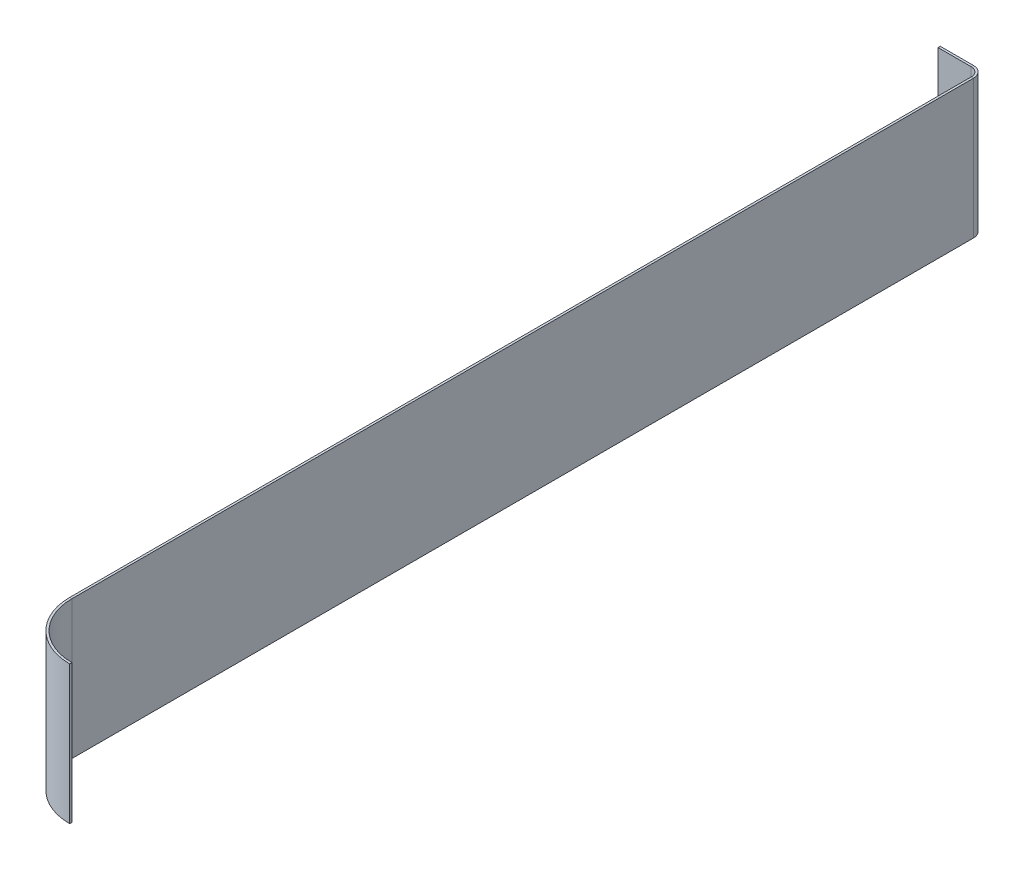
ISO-10303-21;
HEADER;
FILE_DESCRIPTION(('STEP AP214'),'2;1');
FILE_NAME('part.step','',(''),(''),'','','');
FILE_SCHEMA(('AUTOMOTIVE_DESIGN { 1 0 10303 214 1 1 1 1 }'));
ENDSEC;
DATA;
#1=APPLICATION_CONTEXT('core data for automotive mechanical design processes');
#2=APPLICATION_PROTOCOL_DEFINITION('international standard','automotive_design',2000,#1);
#3=PRODUCT_CONTEXT('',#1,'mechanical');
#4=PRODUCT('Part','Part','',(#3));
#5=PRODUCT_RELATED_PRODUCT_CATEGORY('part','',(#4));
#6=PRODUCT_DEFINITION_FORMATION('','',#4);
#7=PRODUCT_DEFINITION_CONTEXT('part definition',#1,'design');
#8=PRODUCT_DEFINITION('design','',#6,#7);
#9=PRODUCT_DEFINITION_SHAPE('','',#8);
#10=(LENGTH_UNIT() NAMED_UNIT(*) SI_UNIT(.MILLI.,.METRE.));
#11=(NAMED_UNIT(*) PLANE_ANGLE_UNIT() SI_UNIT($,.RADIAN.));
#12=(NAMED_UNIT(*) SI_UNIT($,.STERADIAN.) SOLID_ANGLE_UNIT());
#13=UNCERTAINTY_MEASURE_WITH_UNIT(LENGTH_MEASURE(1.E-05),#10,'distance_accuracy_value','');
#14=(GEOMETRIC_REPRESENTATION_CONTEXT(3) GLOBAL_UNCERTAINTY_ASSIGNED_CONTEXT((#13)) GLOBAL_UNIT_ASSIGNED_CONTEXT((#10,
#11,#12)) REPRESENTATION_CONTEXT('',''));
#15=CARTESIAN_POINT('',(0.,0.,0.));
#16=DIRECTION('',(0.,0.,1.));
#17=DIRECTION('',(1.,0.,0.));
#18=AXIS2_PLACEMENT_3D('',#15,#16,#17);
#19=CARTESIAN_POINT('',(-1770.,-495.,5.99999999999999));
#20=DIRECTION('',(0.,1.,0.));
#21=DIRECTION('',(0.,0.,1.));
#22=AXIS2_PLACEMENT_3D('',#19,#20,#21);
#23=PLANE('',#22);
#24=DIRECTION('',(0.,0.,1.));
#25=VECTOR('',#24,1.);
#26=CARTESIAN_POINT('',(-1750.,-495.,22.));
#27=LINE('',#26,#25);
#28=CARTESIAN_POINT('',(-1750.,-495.,22.));
#29=VERTEX_POINT('',#28);
#30=CARTESIAN_POINT('',(-1750.,-495.,1650.));
#31=VERTEX_POINT('',#30);
#32=EDGE_CURVE('E184',#29,#31,#27,.T.);
#33=ORIENTED_EDGE('',*,*,#32,.F.);
#34=DIRECTION('',(-1.,0.,0.));
#35=VECTOR('',#34,1.);
#36=CARTESIAN_POINT('',(-1750.,-495.,22.));
#37=LINE('',#36,#35);
#38=CARTESIAN_POINT('',(-1754.,-495.,22.));
#39=VERTEX_POINT('',#38);
#40=EDGE_CURVE('E11',#29,#39,#37,.T.);
#41=ORIENTED_EDGE('',*,*,#40,.T.);
#42=DIRECTION('',(0.,0.,1.));
#43=VECTOR('',#42,1.);
#44=CARTESIAN_POINT('',(-1754.,-495.,22.));
#45=LINE('',#44,#43);
#46=CARTESIAN_POINT('',(-1754.,-495.,1650.));
#47=VERTEX_POINT('',#46);
#48=EDGE_CURVE('E190',#39,#47,#45,.T.);
#49=ORIENTED_EDGE('',*,*,#48,.T.);
#50=DIRECTION('',(1.,0.,0.));
#51=VECTOR('',#50,1.);
#52=CARTESIAN_POINT('',(-1754.,-495.,1650.));
#53=LINE('',#52,#51);
#54=EDGE_CURVE('E199',#47,#31,#53,.T.);
#55=ORIENTED_EDGE('',*,*,#54,.T.);
#56=EDGE_LOOP('',(#33,#41,#49,#55));
#57=FACE_BOUND('',#56,.T.);
#58=ADVANCED_FACE('F36',(#57),#23,.T.);
#59=CARTESIAN_POINT('',(-1754.,-745.,22.));
#60=DIRECTION('',(-1.,0.,0.));
#61=DIRECTION('',(0.,0.,1.));
#62=AXIS2_PLACEMENT_3D('',#59,#60,#61);
#63=PLANE('',#62);
#64=ORIENTED_EDGE('',*,*,#48,.F.);
#65=DIRECTION('',(0.,1.,0.));
#66=VECTOR('',#65,1.);
#67=CARTESIAN_POINT('',(-1754.,-745.,22.));
#68=LINE('',#67,#66);
#69=CARTESIAN_POINT('',(-1754.,-745.,22.));
#70=VERTEX_POINT('',#69);
#71=EDGE_CURVE('E43',#70,#39,#68,.T.);
#72=ORIENTED_EDGE('',*,*,#71,.F.);
#73=DIRECTION('',(0.,0.,1.));
#74=VECTOR('',#73,1.);
#75=CARTESIAN_POINT('',(-1754.,-745.,22.));
#76=LINE('',#75,#74);
#77=CARTESIAN_POINT('',(-1754.,-745.,1650.));
#78=VERTEX_POINT('',#77);
#79=EDGE_CURVE('E189',#70,#78,#76,.T.);
#80=ORIENTED_EDGE('',*,*,#79,.T.);
#81=DIRECTION('',(0.,1.,0.));
#82=VECTOR('',#81,1.);
#83=CARTESIAN_POINT('',(-1754.,-745.,1650.));
#84=LINE('',#83,#82);
#85=EDGE_CURVE('E202',#78,#47,#84,.T.);
#86=ORIENTED_EDGE('',*,*,#85,.T.);
#87=EDGE_LOOP('',(#64,#72,#80,#86));
#88=FACE_BOUND('',#87,.T.);
#89=ADVANCED_FACE('F260',(#88),#63,.T.);
#90=CARTESIAN_POINT('',(-1750.,-745.,22.));
#91=DIRECTION('',(-1.,0.,0.));
#92=DIRECTION('',(0.,0.,1.));
#93=AXIS2_PLACEMENT_3D('',#90,#91,#92);
#94=PLANE('',#93);
#95=ORIENTED_EDGE('',*,*,#32,.T.);
#96=DIRECTION('',(0.,1.,0.));
#97=VECTOR('',#96,1.);
#98=CARTESIAN_POINT('',(-1750.,-745.,1650.));
#99=LINE('',#98,#97);
#100=CARTESIAN_POINT('',(-1750.,-745.,1650.));
#101=VERTEX_POINT('',#100);
#102=EDGE_CURVE('E193',#101,#31,#99,.T.);
#103=ORIENTED_EDGE('',*,*,#102,.F.);
#104=DIRECTION('',(0.,0.,1.));
#105=VECTOR('',#104,1.);
#106=CARTESIAN_POINT('',(-1750.,-745.,22.));
#107=LINE('',#106,#105);
#108=CARTESIAN_POINT('',(-1750.,-745.,22.));
#109=VERTEX_POINT('',#108);
#110=EDGE_CURVE('E186',#109,#101,#107,.T.);
#111=ORIENTED_EDGE('',*,*,#110,.F.);
#112=DIRECTION('',(0.,1.,0.));
#113=VECTOR('',#112,1.);
#114=CARTESIAN_POINT('',(-1750.,-745.,22.));
#115=LINE('',#114,#113);
#116=EDGE_CURVE('E208',#109,#29,#115,.T.);
#117=ORIENTED_EDGE('',*,*,#116,.T.);
#118=EDGE_LOOP('',(#95,#103,#111,#117));
#119=FACE_BOUND('',#118,.T.);
#120=ADVANCED_FACE('F237',(#119),#94,.F.);
#121=CARTESIAN_POINT('',(-1650.,-745.,1650.));
#122=DIRECTION('',(0.,1.,0.));
#123=DIRECTION('',(1.,0.,0.));
#124=AXIS2_PLACEMENT_3D('',#121,#122,#123);
#125=PLANE('',#124);
#126=ORIENTED_EDGE('',*,*,#110,.T.);
#127=DIRECTION('',(-1.,0.,0.));
#128=VECTOR('',#127,1.);
#129=CARTESIAN_POINT('',(-1750.,-745.,1650.));
#130=LINE('',#129,#128);
#131=EDGE_CURVE('E205',#101,#78,#130,.T.);
#132=ORIENTED_EDGE('',*,*,#131,.T.);
#133=ORIENTED_EDGE('',*,*,#79,.F.);
#134=DIRECTION('',(1.,0.,0.));
#135=VECTOR('',#134,1.);
#136=CARTESIAN_POINT('',(-1754.,-745.,22.));
#137=LINE('',#136,#135);
#138=EDGE_CURVE('E211',#70,#109,#137,.T.);
#139=ORIENTED_EDGE('',*,*,#138,.T.);
#140=EDGE_LOOP('',(#126,#132,#133,#139));
#141=FACE_BOUND('',#140,.T.);
#142=ADVANCED_FACE('F215',(#141),#125,.F.);
#143=CARTESIAN_POINT('',(-1650.,-745.,1650.));
#144=DIRECTION('',(0.,1.,0.));
#145=DIRECTION('',(0.,0.,1.));
#146=AXIS2_PLACEMENT_3D('',#143,#144,#145);
#147=PLANE('',#146);
#148=DIRECTION('',(0.,0.,-1.));
#149=VECTOR('',#148,1.);
#150=CARTESIAN_POINT('',(-1650.,-745.,1750.));
#151=LINE('',#150,#149);
#152=CARTESIAN_POINT('',(-1650.,-745.,1754.));
#153=VERTEX_POINT('',#152);
#154=CARTESIAN_POINT('',(-1650.,-745.,1750.));
#155=VERTEX_POINT('',#154);
#156=EDGE_CURVE('E182',#153,#155,#151,.T.);
#157=ORIENTED_EDGE('',*,*,#156,.F.);
#158=CARTESIAN_POINT('',(-1650.,-745.,1650.));
#159=DIRECTION('',(0.,-1.,0.));
#160=DIRECTION('',(0.,0.,-1.));
#161=AXIS2_PLACEMENT_3D('',#158,#159,#160);
#162=CIRCLE('',#161,104.);
#163=EDGE_CURVE('E57',#153,#78,#162,.T.);
#164=ORIENTED_EDGE('',*,*,#163,.T.);
#165=ORIENTED_EDGE('',*,*,#131,.F.);
#166=CARTESIAN_POINT('',(-1650.,-745.,1650.));
#167=DIRECTION('',(0.,-1.,0.));
#168=DIRECTION('',(0.,0.,-1.));
#169=AXIS2_PLACEMENT_3D('',#166,#167,#168);
#170=CIRCLE('',#169,100.);
#171=EDGE_CURVE('E165',#155,#101,#170,.T.);
#172=ORIENTED_EDGE('',*,*,#171,.F.);
#173=EDGE_LOOP('',(#157,#164,#165,#172));
#174=FACE_BOUND('',#173,.T.);
#175=ADVANCED_FACE('F249',(#174),#147,.F.);
#176=CARTESIAN_POINT('',(-1650.,-495.,1650.));
#177=DIRECTION('',(0.,-1.,0.));
#178=DIRECTION('',(0.,0.,-1.));
#179=AXIS2_PLACEMENT_3D('',#176,#177,#178);
#180=PLANE('',#179);
#181=ORIENTED_EDGE('',*,*,#54,.F.);
#182=CARTESIAN_POINT('',(-1650.,-495.,1650.));
#183=DIRECTION('',(0.,-1.,0.));
#184=DIRECTION('',(0.,0.,-1.));
#185=AXIS2_PLACEMENT_3D('',#182,#183,#184);
#186=CIRCLE('',#185,104.);
#187=CARTESIAN_POINT('',(-1650.,-495.,1754.));
#188=VERTEX_POINT('',#187);
#189=EDGE_CURVE('E176',#47,#188,#186,.F.);
#190=ORIENTED_EDGE('',*,*,#189,.T.);
#191=DIRECTION('',(0.,0.,-1.));
#192=VECTOR('',#191,1.);
#193=CARTESIAN_POINT('',(-1650.,-495.,1750.));
#194=LINE('',#193,#192);
#195=CARTESIAN_POINT('',(-1650.,-495.,1750.));
#196=VERTEX_POINT('',#195);
#197=EDGE_CURVE('E175',#188,#196,#194,.T.);
#198=ORIENTED_EDGE('',*,*,#197,.T.);
#199=CARTESIAN_POINT('',(-1650.,-495.,1650.));
#200=DIRECTION('',(0.,1.,0.));
#201=DIRECTION('',(0.,0.,1.));
#202=AXIS2_PLACEMENT_3D('',#199,#200,#201);
#203=CIRCLE('',#202,100.);
#204=EDGE_CURVE('E168',#31,#196,#203,.T.);
#205=ORIENTED_EDGE('',*,*,#204,.F.);
#206=EDGE_LOOP('',(#181,#190,#198,#205));
#207=FACE_BOUND('',#206,.T.);
#208=ADVANCED_FACE('F244',(#207),#180,.F.);
#209=CARTESIAN_POINT('',(-1650.,-620.,1750.));
#210=DIRECTION('',(-1.,0.,0.));
#211=DIRECTION('',(0.,-1.,0.));
#212=AXIS2_PLACEMENT_3D('',#209,#210,#211);
#213=PLANE('',#212);
#214=DIRECTION('',(0.,-1.,0.));
#215=VECTOR('',#214,1.);
#216=CARTESIAN_POINT('',(-1650.,-323.803389053165,1754.));
#217=LINE('',#216,#215);
#218=EDGE_CURVE('E169',#188,#153,#217,.T.);
#219=ORIENTED_EDGE('',*,*,#218,.T.);
#220=ORIENTED_EDGE('',*,*,#156,.T.);
#221=DIRECTION('',(0.,-1.,0.));
#222=VECTOR('',#221,1.);
#223=CARTESIAN_POINT('',(-1650.,-495.,1750.));
#224=LINE('',#223,#222);
#225=EDGE_CURVE('E172',#196,#155,#224,.T.);
#226=ORIENTED_EDGE('',*,*,#225,.F.);
#227=ORIENTED_EDGE('',*,*,#197,.F.);
#228=EDGE_LOOP('',(#219,#220,#226,#227));
#229=FACE_BOUND('',#228,.T.);
#230=ADVANCED_FACE('F248',(#229),#213,.F.);
#231=CARTESIAN_POINT('',(-1650.,-323.803389053165,1650.));
#232=DIRECTION('',(0.,-1.,0.));
#233=DIRECTION('',(0.,0.,-1.));
#234=AXIS2_PLACEMENT_3D('',#231,#232,#233);
#235=CYLINDRICAL_SURFACE('',#234,100.);
#236=ORIENTED_EDGE('',*,*,#204,.T.);
#237=ORIENTED_EDGE('',*,*,#225,.T.);
#238=ORIENTED_EDGE('',*,*,#171,.T.);
#239=ORIENTED_EDGE('',*,*,#102,.T.);
#240=EDGE_LOOP('',(#236,#237,#238,#239));
#241=FACE_BOUND('',#240,.T.);
#242=ADVANCED_FACE('F240',(#241),#235,.F.);
#243=CARTESIAN_POINT('',(-1650.,-323.803389053165,1650.));
#244=DIRECTION('',(0.,-1.,0.));
#245=DIRECTION('',(0.,0.,-1.));
#246=AXIS2_PLACEMENT_3D('',#243,#244,#245);
#247=CYLINDRICAL_SURFACE('',#246,104.);
#248=ORIENTED_EDGE('',*,*,#189,.F.);
#249=ORIENTED_EDGE('',*,*,#85,.F.);
#250=ORIENTED_EDGE('',*,*,#163,.F.);
#251=ORIENTED_EDGE('',*,*,#218,.F.);
#252=EDGE_LOOP('',(#248,#249,#250,#251));
#253=FACE_BOUND('',#252,.T.);
#254=ADVANCED_FACE('F268',(#253),#247,.T.);
#255=CARTESIAN_POINT('',(-1770.,-745.,22.));
#256=DIRECTION('',(0.,-1.,0.));
#257=DIRECTION('',(0.,0.,-1.));
#258=AXIS2_PLACEMENT_3D('',#255,#256,#257);
#259=PLANE('',#258);
#260=ORIENTED_EDGE('',*,*,#138,.F.);
#261=CARTESIAN_POINT('',(-1770.,-745.,22.));
#262=DIRECTION('',(0.,1.,0.));
#263=DIRECTION('',(0.,0.,1.));
#264=AXIS2_PLACEMENT_3D('',#261,#262,#263);
#265=CIRCLE('',#264,16.);
#266=CARTESIAN_POINT('',(-1770.,-745.,6.00000000000001));
#267=VERTEX_POINT('',#266);
#268=EDGE_CURVE('E161',#70,#267,#265,.T.);
#269=ORIENTED_EDGE('',*,*,#268,.T.);
#270=DIRECTION('',(0.,0.,1.));
#271=VECTOR('',#270,1.);
#272=CARTESIAN_POINT('',(-1770.,-745.,2.));
#273=LINE('',#272,#271);
#274=CARTESIAN_POINT('',(-1770.,-745.,2.));
#275=VERTEX_POINT('',#274);
#276=EDGE_CURVE('E133',#275,#267,#273,.T.);
#277=ORIENTED_EDGE('',*,*,#276,.F.);
#278=CARTESIAN_POINT('',(-1770.,-745.,22.));
#279=DIRECTION('',(0.,1.,0.));
#280=DIRECTION('',(0.,0.,1.));
#281=AXIS2_PLACEMENT_3D('',#278,#279,#280);
#282=CIRCLE('',#281,20.);
#283=EDGE_CURVE('E153',#109,#275,#282,.T.);
#284=ORIENTED_EDGE('',*,*,#283,.F.);
#285=EDGE_LOOP('',(#260,#269,#277,#284));
#286=FACE_BOUND('',#285,.T.);
#287=ADVANCED_FACE('F219',(#286),#259,.T.);
#288=CARTESIAN_POINT('',(-1770.,-495.,22.));
#289=DIRECTION('',(0.,1.,0.));
#290=DIRECTION('',(0.,0.,1.));
#291=AXIS2_PLACEMENT_3D('',#288,#289,#290);
#292=PLANE('',#291);
#293=DIRECTION('',(0.,0.,-1.));
#294=VECTOR('',#293,1.);
#295=CARTESIAN_POINT('',(-1770.,-495.,6.00000000000001));
#296=LINE('',#295,#294);
#297=CARTESIAN_POINT('',(-1770.,-495.,6.00000000000001));
#298=VERTEX_POINT('',#297);
#299=CARTESIAN_POINT('',(-1770.,-495.,1.99999999999999));
#300=VERTEX_POINT('',#299);
#301=EDGE_CURVE('E164',#298,#300,#296,.T.);
#302=ORIENTED_EDGE('',*,*,#301,.F.);
#303=CARTESIAN_POINT('',(-1770.,-495.,22.));
#304=DIRECTION('',(0.,1.,0.));
#305=DIRECTION('',(0.,0.,1.));
#306=AXIS2_PLACEMENT_3D('',#303,#304,#305);
#307=CIRCLE('',#306,16.);
#308=EDGE_CURVE('E157',#298,#39,#307,.F.);
#309=ORIENTED_EDGE('',*,*,#308,.T.);
#310=ORIENTED_EDGE('',*,*,#40,.F.);
#311=CARTESIAN_POINT('',(-1770.,-495.,22.));
#312=DIRECTION('',(0.,-1.,0.));
#313=DIRECTION('',(0.,0.,-1.));
#314=AXIS2_PLACEMENT_3D('',#311,#312,#313);
#315=CIRCLE('',#314,20.);
#316=EDGE_CURVE('E156',#300,#29,#315,.T.);
#317=ORIENTED_EDGE('',*,*,#316,.F.);
#318=EDGE_LOOP('',(#302,#309,#310,#317));
#319=FACE_BOUND('',#318,.T.);
#320=ADVANCED_FACE('F225',(#319),#292,.T.);
#321=CARTESIAN_POINT('',(-1770.,-871.469519129105,22.));
#322=DIRECTION('',(0.,1.,0.));
#323=DIRECTION('',(0.,0.,1.));
#324=AXIS2_PLACEMENT_3D('',#321,#322,#323);
#325=CYLINDRICAL_SURFACE('',#324,20.);
#326=ORIENTED_EDGE('',*,*,#316,.T.);
#327=ORIENTED_EDGE('',*,*,#116,.F.);
#328=ORIENTED_EDGE('',*,*,#283,.T.);
#329=DIRECTION('',(0.,1.,0.));
#330=VECTOR('',#329,1.);
#331=CARTESIAN_POINT('',(-1770.,-745.,2.));
#332=LINE('',#331,#330);
#333=EDGE_CURVE('E150',#275,#300,#332,.T.);
#334=ORIENTED_EDGE('',*,*,#333,.T.);
#335=EDGE_LOOP('',(#326,#327,#328,#334));
#336=FACE_BOUND('',#335,.T.);
#337=ADVANCED_FACE('F234',(#336),#325,.T.);
#338=CARTESIAN_POINT('',(-1770.,-871.469519129105,22.));
#339=DIRECTION('',(0.,1.,0.));
#340=DIRECTION('',(0.,0.,1.));
#341=AXIS2_PLACEMENT_3D('',#338,#339,#340);
#342=CYLINDRICAL_SURFACE('',#341,16.);
#343=ORIENTED_EDGE('',*,*,#308,.F.);
#344=DIRECTION('',(0.,1.,0.));
#345=VECTOR('',#344,1.);
#346=CARTESIAN_POINT('',(-1770.,-745.,6.00000000000001));
#347=LINE('',#346,#345);
#348=EDGE_CURVE('E138',#267,#298,#347,.T.);
#349=ORIENTED_EDGE('',*,*,#348,.F.);
#350=ORIENTED_EDGE('',*,*,#268,.F.);
#351=ORIENTED_EDGE('',*,*,#71,.T.);
#352=EDGE_LOOP('',(#343,#349,#350,#351));
#353=FACE_BOUND('',#352,.T.);
#354=ADVANCED_FACE('F221',(#353),#342,.F.);
#355=CARTESIAN_POINT('',(-1830.,-745.,6.00000000000001));
#356=DIRECTION('',(1.,0.,0.));
#357=DIRECTION('',(0.,0.,-1.));
#358=AXIS2_PLACEMENT_3D('',#355,#356,#357);
#359=PLANE('',#358);
#360=DIRECTION('',(0.,0.,-1.));
#361=VECTOR('',#360,1.);
#362=CARTESIAN_POINT('',(-1830.,-495.,6.00000000000001));
#363=LINE('',#362,#361);
#364=CARTESIAN_POINT('',(-1830.,-495.,6.00000000000001));
#365=VERTEX_POINT('',#364);
#366=CARTESIAN_POINT('',(-1830.,-495.,2.));
#367=VERTEX_POINT('',#366);
#368=EDGE_CURVE('E123',#365,#367,#363,.T.);
#369=ORIENTED_EDGE('',*,*,#368,.T.);
#370=DIRECTION('',(0.,1.,0.));
#371=VECTOR('',#370,1.);
#372=CARTESIAN_POINT('',(-1830.,-745.,2.));
#373=LINE('',#372,#371);
#374=CARTESIAN_POINT('',(-1830.,-745.,2.));
#375=VERTEX_POINT('',#374);
#376=EDGE_CURVE('E129',#375,#367,#373,.T.);
#377=ORIENTED_EDGE('',*,*,#376,.F.);
#378=DIRECTION('',(0.,0.,-1.));
#379=VECTOR('',#378,1.);
#380=CARTESIAN_POINT('',(-1830.,-745.,6.00000000000001));
#381=LINE('',#380,#379);
#382=CARTESIAN_POINT('',(-1830.,-745.,6.00000000000001));
#383=VERTEX_POINT('',#382);
#384=EDGE_CURVE('E126',#383,#375,#381,.T.);
#385=ORIENTED_EDGE('',*,*,#384,.F.);
#386=DIRECTION('',(0.,1.,0.));
#387=VECTOR('',#386,1.);
#388=CARTESIAN_POINT('',(-1830.,-745.,6.00000000000001));
#389=LINE('',#388,#387);
#390=EDGE_CURVE('E112',#383,#365,#389,.T.);
#391=ORIENTED_EDGE('',*,*,#390,.T.);
#392=EDGE_LOOP('',(#369,#377,#385,#391));
#393=FACE_BOUND('',#392,.T.);
#394=ADVANCED_FACE('F127',(#393),#359,.F.);
#395=CARTESIAN_POINT('',(-1770.,-745.,2.));
#396=DIRECTION('',(0.,0.,1.));
#397=DIRECTION('',(1.,0.,0.));
#398=AXIS2_PLACEMENT_3D('',#395,#396,#397);
#399=PLANE('',#398);
#400=DIRECTION('',(1.,0.,0.));
#401=VECTOR('',#400,1.);
#402=CARTESIAN_POINT('',(-1770.,-495.,2.));
#403=LINE('',#402,#401);
#404=EDGE_CURVE('E122',#367,#300,#403,.T.);
#405=ORIENTED_EDGE('',*,*,#404,.T.);
#406=ORIENTED_EDGE('',*,*,#333,.F.);
#407=DIRECTION('',(1.,0.,0.));
#408=VECTOR('',#407,1.);
#409=CARTESIAN_POINT('',(-1770.,-745.,2.));
#410=LINE('',#409,#408);
#411=EDGE_CURVE('E144',#375,#275,#410,.T.);
#412=ORIENTED_EDGE('',*,*,#411,.F.);
#413=ORIENTED_EDGE('',*,*,#376,.T.);
#414=EDGE_LOOP('',(#405,#406,#412,#413));
#415=FACE_BOUND('',#414,.T.);
#416=ADVANCED_FACE('F232',(#415),#399,.F.);
#417=CARTESIAN_POINT('',(-1754.,-745.,22.));
#418=DIRECTION('',(0.,-1.,0.));
#419=DIRECTION('',(0.,0.,-1.));
#420=AXIS2_PLACEMENT_3D('',#417,#418,#419);
#421=PLANE('',#420);
#422=ORIENTED_EDGE('',*,*,#411,.T.);
#423=ORIENTED_EDGE('',*,*,#276,.T.);
#424=DIRECTION('',(1.,0.,0.));
#425=VECTOR('',#424,1.);
#426=CARTESIAN_POINT('',(-1770.,-745.,6.00000000000001));
#427=LINE('',#426,#425);
#428=EDGE_CURVE('E117',#383,#267,#427,.T.);
#429=ORIENTED_EDGE('',*,*,#428,.F.);
#430=ORIENTED_EDGE('',*,*,#384,.T.);
#431=EDGE_LOOP('',(#422,#423,#429,#430));
#432=FACE_BOUND('',#431,.T.);
#433=ADVANCED_FACE('F135',(#432),#421,.T.);
#434=CARTESIAN_POINT('',(-1770.,-745.,6.00000000000001));
#435=DIRECTION('',(0.,0.,1.));
#436=DIRECTION('',(1.,0.,0.));
#437=AXIS2_PLACEMENT_3D('',#434,#435,#436);
#438=PLANE('',#437);
#439=DIRECTION('',(1.,0.,0.));
#440=VECTOR('',#439,1.);
#441=CARTESIAN_POINT('',(-1770.,-495.,6.00000000000001));
#442=LINE('',#441,#440);
#443=EDGE_CURVE('E119',#365,#298,#442,.T.);
#444=ORIENTED_EDGE('',*,*,#443,.F.);
#445=ORIENTED_EDGE('',*,*,#390,.F.);
#446=ORIENTED_EDGE('',*,*,#428,.T.);
#447=ORIENTED_EDGE('',*,*,#348,.T.);
#448=EDGE_LOOP('',(#444,#445,#446,#447));
#449=FACE_BOUND('',#448,.T.);
#450=ADVANCED_FACE('F114',(#449),#438,.T.);
#451=CARTESIAN_POINT('',(-1650.,-495.,1650.));
#452=DIRECTION('',(0.,1.,0.));
#453=DIRECTION('',(1.,0.,0.));
#454=AXIS2_PLACEMENT_3D('',#451,#452,#453);
#455=PLANE('',#454);
#456=ORIENTED_EDGE('',*,*,#443,.T.);
#457=ORIENTED_EDGE('',*,*,#301,.T.);
#458=ORIENTED_EDGE('',*,*,#404,.F.);
#459=ORIENTED_EDGE('',*,*,#368,.F.);
#460=EDGE_LOOP('',(#456,#457,#458,#459));
#461=FACE_BOUND('',#460,.T.);
#462=ADVANCED_FACE('F230',(#461),#455,.T.);
#463=CLOSED_SHELL('',(#58,#89,#120,#142,#175,#208,#230,#242,#254,#287,#320,#337,#354,#394,#416,
#433,#450,#462));
#464=MANIFOLD_SOLID_BREP('B2',#463);
#465=ADVANCED_BREP_SHAPE_REPRESENTATION('',(#18,#464),#14);
#466=SHAPE_DEFINITION_REPRESENTATION(#9,#465);
ENDSEC;
END-ISO-10303-21;
